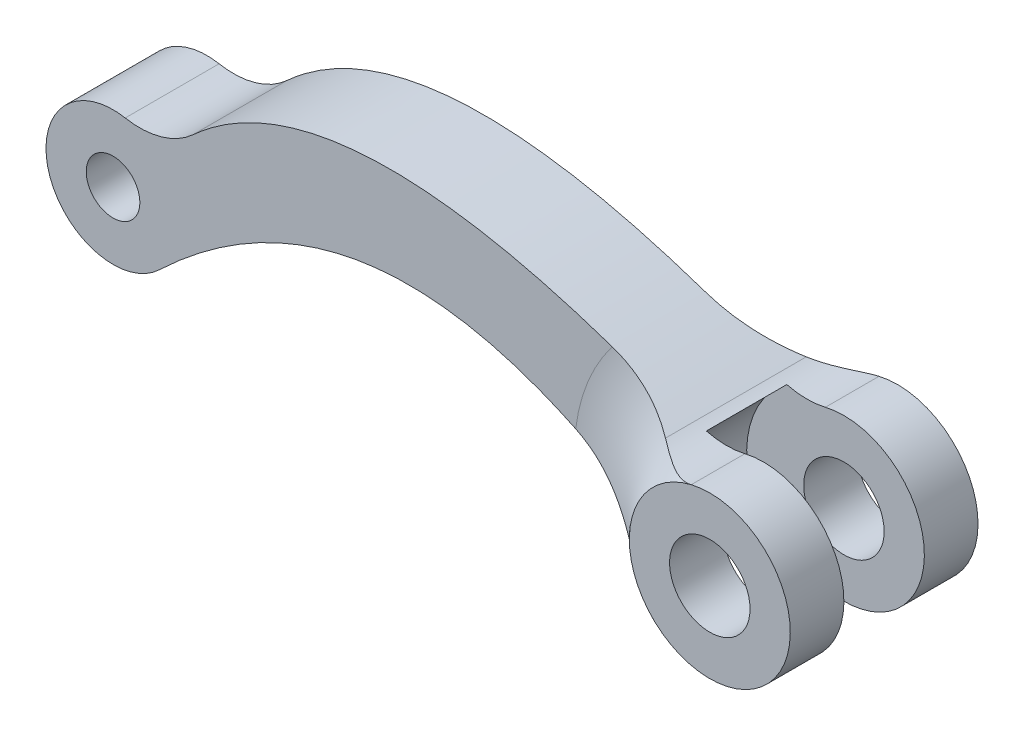
ISO-10303-21;
HEADER;
FILE_DESCRIPTION(('STEP AP214'),'2;1');
FILE_NAME('part.step','',(''),(''),'','','');
FILE_SCHEMA(('AUTOMOTIVE_DESIGN { 1 0 10303 214 1 1 1 1 }'));
ENDSEC;
DATA;
#1=APPLICATION_CONTEXT('core data for automotive mechanical design processes');
#2=APPLICATION_PROTOCOL_DEFINITION('international standard','automotive_design',2000,#1);
#3=PRODUCT_CONTEXT('',#1,'mechanical');
#4=PRODUCT('Part','Part','',(#3));
#5=PRODUCT_RELATED_PRODUCT_CATEGORY('part','',(#4));
#6=PRODUCT_DEFINITION_FORMATION('','',#4);
#7=PRODUCT_DEFINITION_CONTEXT('part definition',#1,'design');
#8=PRODUCT_DEFINITION('design','',#6,#7);
#9=PRODUCT_DEFINITION_SHAPE('','',#8);
#10=(LENGTH_UNIT() NAMED_UNIT(*) SI_UNIT(.MILLI.,.METRE.));
#11=(NAMED_UNIT(*) PLANE_ANGLE_UNIT() SI_UNIT($,.RADIAN.));
#12=(NAMED_UNIT(*) SI_UNIT($,.STERADIAN.) SOLID_ANGLE_UNIT());
#13=UNCERTAINTY_MEASURE_WITH_UNIT(LENGTH_MEASURE(1.E-05),#10,'distance_accuracy_value','');
#14=(GEOMETRIC_REPRESENTATION_CONTEXT(3) GLOBAL_UNCERTAINTY_ASSIGNED_CONTEXT((#13)) GLOBAL_UNIT_ASSIGNED_CONTEXT((#10,
#11,#12)) REPRESENTATION_CONTEXT('',''));
#15=CARTESIAN_POINT('',(0.,0.,0.));
#16=DIRECTION('',(0.,0.,1.));
#17=DIRECTION('',(1.,0.,0.));
#18=AXIS2_PLACEMENT_3D('',#15,#16,#17);
#19=CARTESIAN_POINT('',(19.8983455951839,-4.37909021869303,1.75));
#20=DIRECTION('',(0.,0.,-1.));
#21=DIRECTION('',(-1.,0.,0.));
#22=AXIS2_PLACEMENT_3D('',#19,#20,#21);
#23=CYLINDRICAL_SURFACE('',#22,3.);
#24=CARTESIAN_POINT('',(19.8983455951839,-4.37909021869303,-1.5));
#25=DIRECTION('',(0.,0.,1.));
#26=DIRECTION('',(1.,0.,0.));
#27=AXIS2_PLACEMENT_3D('',#24,#25,#26);
#28=CIRCLE('',#27,3.);
#29=CARTESIAN_POINT('',(21.7342481345183,-2.00644151606854,-1.5));
#30=VERTEX_POINT('',#29);
#31=CARTESIAN_POINT('',(21.949172797592,-2.18954510934651,-1.5));
#32=VERTEX_POINT('',#31);
#33=EDGE_CURVE('E170',#30,#32,#28,.F.);
#34=ORIENTED_EDGE('',*,*,#33,.F.);
#35=DIRECTION('',(0.,0.,-1.));
#36=VECTOR('',#35,1.);
#37=CARTESIAN_POINT('',(21.7342481345183,-2.00644151606854,1.75));
#38=LINE('',#37,#36);
#39=CARTESIAN_POINT('',(21.7342481345183,-2.00644151606854,-3.46932138033454));
#40=VERTEX_POINT('',#39);
#41=EDGE_CURVE('E53',#30,#40,#38,.T.);
#42=ORIENTED_EDGE('',*,*,#41,.T.);
#43=CARTESIAN_POINT('',(21.7342481345183,-2.00644151606854,-3.46932138033454));
#44=CARTESIAN_POINT('',(21.7526198289137,-2.02065607514948,-3.47430392840961));
#45=CARTESIAN_POINT('',(21.7709236479257,-2.03516135527994,-3.47872480307188));
#46=CARTESIAN_POINT('',(21.8072747281919,-2.06467136872878,-3.4863587269212));
#47=CARTESIAN_POINT('',(21.825322644006,-2.07967426383743,-3.48957577716496));
#48=CARTESIAN_POINT('',(21.861166540102,-2.11019449768173,-3.49475214225256));
#49=CARTESIAN_POINT('',(21.8789625005552,-2.12571187658907,-3.49671135863845));
#50=CARTESIAN_POINT('',(21.9142950857563,-2.15726386587699,-3.49933988944338));
#51=CARTESIAN_POINT('',(21.9318306365243,-2.17330004082508,-3.50000484181938));
#52=CARTESIAN_POINT('',(21.949172797592,-2.18954510934651,-3.5));
#53=B_SPLINE_CURVE_WITH_KNOTS('',3,(#43,#44,#45,#46,#47,#48,#49,#50,#51,#52),.UNSPECIFIED.,.F.,
.F.,(4,2,2,2,4),(0.,0.0712681844317605,0.142297350987069,0.213332076730677,0.28460579825421),.UNSPECIFIED.);
#54=CARTESIAN_POINT('',(21.949172797592,-2.18954510934652,-3.5));
#55=VERTEX_POINT('',#54);
#56=EDGE_CURVE('E11',#40,#55,#53,.T.);
#57=ORIENTED_EDGE('',*,*,#56,.T.);
#58=DIRECTION('',(0.,0.,-1.));
#59=VECTOR('',#58,1.);
#60=CARTESIAN_POINT('',(21.949172797592,-2.18954510934651,1.75));
#61=LINE('',#60,#59);
#62=EDGE_CURVE('E286',#32,#55,#61,.T.);
#63=ORIENTED_EDGE('',*,*,#62,.F.);
#64=EDGE_LOOP('',(#34,#42,#57,#63));
#65=FACE_BOUND('',#64,.T.);
#66=ADVANCED_FACE('F34',(#65),#23,.F.);
#67=CARTESIAN_POINT('',(24.,0.,1.75));
#68=DIRECTION('',(0.,0.,-1.));
#69=DIRECTION('',(-1.,0.,0.));
#70=AXIS2_PLACEMENT_3D('',#67,#68,#69);
#71=CYLINDRICAL_SURFACE('',#70,3.);
#72=CARTESIAN_POINT('',(24.,0.,-3.5));
#73=DIRECTION('',(0.,0.,1.));
#74=DIRECTION('',(1.,0.,0.));
#75=AXIS2_PLACEMENT_3D('',#72,#73,#74);
#76=CIRCLE('',#75,3.);
#77=CARTESIAN_POINT('',(23.3091798104987,2.91937792445195,-3.5));
#78=VERTEX_POINT('',#77);
#79=EDGE_CURVE('E177',#55,#78,#76,.T.);
#80=ORIENTED_EDGE('',*,*,#79,.T.);
#81=DIRECTION('',(0.,0.,-1.));
#82=VECTOR('',#81,1.);
#83=CARTESIAN_POINT('',(23.3091798104987,2.91937792445194,1.75));
#84=LINE('',#83,#82);
#85=CARTESIAN_POINT('',(23.3091798104987,2.91937792445195,-1.5));
#86=VERTEX_POINT('',#85);
#87=EDGE_CURVE('E292',#78,#86,#84,.F.);
#88=ORIENTED_EDGE('',*,*,#87,.T.);
#89=CARTESIAN_POINT('',(24.,0.,-1.5));
#90=DIRECTION('',(0.,0.,1.));
#91=DIRECTION('',(1.,0.,0.));
#92=AXIS2_PLACEMENT_3D('',#89,#90,#91);
#93=CIRCLE('',#92,3.);
#94=EDGE_CURVE('E402',#32,#86,#93,.T.);
#95=ORIENTED_EDGE('',*,*,#94,.F.);
#96=ORIENTED_EDGE('',*,*,#62,.T.);
#97=EDGE_LOOP('',(#80,#88,#95,#96));
#98=FACE_BOUND('',#97,.T.);
#99=ADVANCED_FACE('F242',(#98),#71,.T.);
#100=CARTESIAN_POINT('',(1.73493515728975,-1.8,1.75));
#101=CARTESIAN_POINT('',(10.5890763200093,6.61744334853081,1.75));
#102=CARTESIAN_POINT('',(21.7342481345183,-2.00644151606854,1.75));
#103=B_SPLINE_CURVE_WITH_KNOTS('',2,(#100,#101,#102),.UNSPECIFIED.,.F.,.F.,(3,3),(0.,1.),.UNSPECIFIED.);
#104=DIRECTION('',(0.,0.,-1.));
#105=VECTOR('',#104,1.);
#106=SURFACE_OF_LINEAR_EXTRUSION('',#103,#105);
#107=CARTESIAN_POINT('',(1.73493515728975,-1.8,-1.5));
#108=CARTESIAN_POINT('',(10.5890763200093,6.61744334853081,-1.5));
#109=CARTESIAN_POINT('',(21.7342481345183,-2.00644151606854,-1.5));
#110=B_SPLINE_CURVE_WITH_KNOTS('',2,(#107,#108,#109),.UNSPECIFIED.,.F.,.F.,(3,3),(0.,1.),.UNSPECIFIED.);
#111=CARTESIAN_POINT('',(20.5587948379701,-1.13982822192764,-1.5));
#112=VERTEX_POINT('',#111);
#113=EDGE_CURVE('E164',#112,#30,#110,.T.);
#114=ORIENTED_EDGE('',*,*,#113,.F.);
#115=DIRECTION('',(0.,0.,-1.));
#116=VECTOR('',#115,1.);
#117=CARTESIAN_POINT('',(20.5587948379701,-1.13982822192764,1.75));
#118=LINE('',#117,#116);
#119=CARTESIAN_POINT('',(20.5587948379701,-1.13982822192764,1.5));
#120=VERTEX_POINT('',#119);
#121=EDGE_CURVE('E155',#112,#120,#118,.F.);
#122=ORIENTED_EDGE('',*,*,#121,.T.);
#123=CARTESIAN_POINT('',(1.73493515728975,-1.8,1.5));
#124=CARTESIAN_POINT('',(10.5890763200093,6.61744334853081,1.5));
#125=CARTESIAN_POINT('',(21.7342481345183,-2.00644151606854,1.5));
#126=B_SPLINE_CURVE_WITH_KNOTS('',2,(#123,#124,#125),.UNSPECIFIED.,.F.,.F.,(3,3),(0.,1.),.UNSPECIFIED.);
#127=CARTESIAN_POINT('',(21.7342481345183,-2.00644151606854,1.5));
#128=VERTEX_POINT('',#127);
#129=EDGE_CURVE('E140',#120,#128,#126,.T.);
#130=ORIENTED_EDGE('',*,*,#129,.T.);
#131=CARTESIAN_POINT('',(21.7342481345183,-2.00644151606854,3.46932138033453));
#132=VERTEX_POINT('',#131);
#133=EDGE_CURVE('E272',#132,#128,#38,.T.);
#134=ORIENTED_EDGE('',*,*,#133,.F.);
#135=CARTESIAN_POINT('',(21.7342481345183,-2.00644151606854,3.46932138033453));
#136=CARTESIAN_POINT('',(21.6734804954553,-1.95942119551907,3.45285193536921));
#137=CARTESIAN_POINT('',(21.6131640722433,-1.91308977671675,3.43320879719704));
#138=CARTESIAN_POINT('',(21.4937909265621,-1.82205245682198,3.38900424658843));
#139=CARTESIAN_POINT('',(21.4347284427622,-1.7773376798083,3.36447700349402));
#140=CARTESIAN_POINT('',(21.317537619663,-1.68925063622987,3.31173796775486));
#141=CARTESIAN_POINT('',(21.2594074098336,-1.64587545917933,3.28353497772249));
#142=CARTESIAN_POINT('',(21.1437493558439,-1.56019645073285,3.22446437002579));
#143=CARTESIAN_POINT('',(21.0862213850932,-1.51789239142399,3.19359732548866));
#144=CARTESIAN_POINT('',(20.9707131943213,-1.43357168487102,3.12961549101444));
#145=CARTESIAN_POINT('',(20.912738151409,-1.39156764794546,3.09647500815804));
#146=CARTESIAN_POINT('',(20.7968572541206,-1.30824216394491,3.02904561306408));
#147=CARTESIAN_POINT('',(20.7389515368889,-1.26692148223411,2.9947555282452));
#148=CARTESIAN_POINT('',(20.6230011470518,-1.18481862553785,2.92563043624156));
#149=CARTESIAN_POINT('',(20.5649564011451,-1.1440368975453,2.89079502339822));
#150=CARTESIAN_POINT('',(20.4485571918544,-1.06290323794126,2.82108226724726));
#151=CARTESIAN_POINT('',(20.3902026307496,-1.02255145569827,2.7862049137695));
#152=CARTESIAN_POINT('',(20.2220074421137,-0.907192088073592,2.68663467901254));
#153=CARTESIAN_POINT('',(20.1115848176147,-0.832606276815641,2.6224270553171));
#154=CARTESIAN_POINT('',(19.8883051701104,-0.684224765570693,2.49757478161263));
#155=CARTESIAN_POINT('',(19.775449514185,-0.610428655037382,2.43692819855455));
#156=CARTESIAN_POINT('',(19.5466700067505,-0.463418696099621,2.32085630904226));
#157=CARTESIAN_POINT('',(19.4307458875446,-0.390204899226374,2.26543146007465));
#158=CARTESIAN_POINT('',(19.196899758719,-0.245267633638991,2.16186044974607));
#159=CARTESIAN_POINT('',(19.0790169961946,-0.173536750460456,2.11363671113366));
#160=CARTESIAN_POINT('',(18.8398580269226,-0.0309031661338106,2.02491420561541));
#161=CARTESIAN_POINT('',(18.7185817478715,0.0399995173226713,1.98441560344818));
#162=CARTESIAN_POINT('',(18.4728574037876,0.180573666534587,1.91224664931044));
#163=CARTESIAN_POINT('',(18.3484118108324,0.25024602420635,1.88056963354288));
#164=CARTESIAN_POINT('',(18.0653837672967,0.405019529676066,1.82032360057307));
#165=CARTESIAN_POINT('',(17.9059622177385,0.489680667384373,1.79445511900599));
#166=CARTESIAN_POINT('',(17.6630892959685,0.614558385246709,1.76805730319302));
#167=CARTESIAN_POINT('',(17.58095428413,0.656098557506864,1.76132312596252));
#168=CARTESIAN_POINT('',(17.4159080686405,0.738147241324251,1.75229311742182));
#169=CARTESIAN_POINT('',(17.3329967039666,0.778655532073645,1.74999822831197));
#170=CARTESIAN_POINT('',(17.2497813184491,0.818580467393256,1.75));
#171=B_SPLINE_CURVE_WITH_KNOTS('',3,(#135,#136,#137,#138,#139,#140,#141,#142,#143,#144,#145,
#146,#147,#148,#149,#150,#151,#152,#153,#154,#155,#156,#157,#158,#159,#160,#161,#162,#163,#164,
#165,#166,#167,#168,#169,#170),.UNSPECIFIED.,.F.,.F.,(4,2,2,2,2,2,2,2,2,2,2,2,2,2,2,2,2,4),(0.,
0.2355354018149,0.469477486421311,0.702869285716018,0.936210999194895,1.17286598895296,
1.40977018336104,1.64685987724214,1.88402941620388,2.32773676239872,2.77120097967103,
3.21470401367263,3.65301778680796,4.0913409059439,4.52933201352217,5.07551339134825,
5.35227673222676,5.62909880727952),.UNSPECIFIED.);
#172=CARTESIAN_POINT('',(17.2497813184491,0.818580467393257,1.75));
#173=VERTEX_POINT('',#172);
#174=EDGE_CURVE('E315',#132,#173,#171,.T.);
#175=ORIENTED_EDGE('',*,*,#174,.T.);
#176=CARTESIAN_POINT('',(1.73493515728975,-1.8,1.75));
#177=VERTEX_POINT('',#176);
#178=EDGE_CURVE('E248',#177,#173,#103,.T.);
#179=ORIENTED_EDGE('',*,*,#178,.F.);
#180=DIRECTION('',(0.,0.,-1.));
#181=VECTOR('',#180,1.);
#182=CARTESIAN_POINT('',(1.73493515728975,-1.8,1.75));
#183=LINE('',#182,#181);
#184=CARTESIAN_POINT('',(1.73493515728975,-1.8,-1.75));
#185=VERTEX_POINT('',#184);
#186=EDGE_CURVE('E277',#177,#185,#183,.T.);
#187=ORIENTED_EDGE('',*,*,#186,.T.);
#188=CARTESIAN_POINT('',(1.73493515728975,-1.8,-1.75));
#189=CARTESIAN_POINT('',(10.5890763200093,6.61744334853081,-1.75));
#190=CARTESIAN_POINT('',(21.7342481345183,-2.00644151606854,-1.75));
#191=B_SPLINE_CURVE_WITH_KNOTS('',2,(#188,#189,#190),.UNSPECIFIED.,.F.,.F.,(3,3),(0.,1.),.UNSPECIFIED.);
#192=CARTESIAN_POINT('',(17.2497813184491,0.818580467393257,-1.75));
#193=VERTEX_POINT('',#192);
#194=EDGE_CURVE('E199',#185,#193,#191,.T.);
#195=ORIENTED_EDGE('',*,*,#194,.T.);
#196=CARTESIAN_POINT('',(17.2497813184491,0.818580467393257,-1.75));
#197=CARTESIAN_POINT('',(17.3371154760831,0.776680567426927,-1.74999448989186));
#198=CARTESIAN_POINT('',(17.4241261777844,0.734130820742864,-1.75252460736791));
#199=CARTESIAN_POINT('',(17.5972030024072,0.647941578124018,-1.76246302927046));
#200=CARTESIAN_POINT('',(17.6832700893189,0.604303380197852,-1.76986576764265));
#201=CARTESIAN_POINT('',(17.8543330344919,0.516065879495559,-1.7893538993404));
#202=CARTESIAN_POINT('',(17.9393292468216,0.471466908343907,-1.80143770063367));
#203=CARTESIAN_POINT('',(18.1065302853072,0.382296516639167,-1.82979454547133));
#204=CARTESIAN_POINT('',(18.1887575199014,0.33774045619772,-1.8459842371373));
#205=CARTESIAN_POINT('',(18.3519615042621,0.247960560203948,-1.88242746112701));
#206=CARTESIAN_POINT('',(18.4329379328068,0.202736558763347,-1.90268201926609));
#207=CARTESIAN_POINT('',(18.5935398035643,0.111750526183883,-1.94699616574966));
#208=CARTESIAN_POINT('',(18.6731651412377,0.0659884538718848,-1.97105604705434));
#209=CARTESIAN_POINT('',(18.8416357342252,-0.0321570800999786,-2.02617764674639));
#210=CARTESIAN_POINT('',(18.9302789560651,-0.0846024923440787,-2.05774593496078));
#211=CARTESIAN_POINT('',(19.1057290274,-0.189923303514532,-2.12497404143243));
#212=CARTESIAN_POINT('',(19.1925358984641,-0.242798697380328,-2.16063381160064));
#213=CARTESIAN_POINT('',(19.3643456768693,-0.348893621099651,-2.23555372545197));
#214=CARTESIAN_POINT('',(19.4493487718382,-0.402113114401269,-2.27481349238184));
#215=CARTESIAN_POINT('',(19.6182960311716,-0.509269046093717,-2.35670628477786));
#216=CARTESIAN_POINT('',(19.7022273815612,-0.563207864744022,-2.39936250915869));
#217=CARTESIAN_POINT('',(19.8685501632664,-0.671429227119991,-2.48717305131634));
#218=CARTESIAN_POINT('',(19.9509414801599,-0.725711795987791,-2.5323275537322));
#219=CARTESIAN_POINT('',(20.1144585517368,-0.834723778051313,-2.62444195648333));
#220=CARTESIAN_POINT('',(20.1955837992161,-0.889453357595377,-2.67140255552382));
#221=CARTESIAN_POINT('',(20.3371314678077,-0.986034088861208,-2.75465498380698));
#222=CARTESIAN_POINT('',(20.3977605853121,-1.02775827398713,-2.79074447401928));
#223=CARTESIAN_POINT('',(20.5186409037786,-1.1116418559758,-2.86301650258537));
#224=CARTESIAN_POINT('',(20.5788921714409,-1.1538011723396,-2.89919902283059));
#225=CARTESIAN_POINT('',(20.6992002744113,-1.23867012954327,-2.97111936445906));
#226=CARTESIAN_POINT('',(20.7592572117624,-1.28137938899856,-3.00685746345524));
#227=CARTESIAN_POINT('',(20.8794003645614,-1.36750115286112,-3.0772419894545));
#228=CARTESIAN_POINT('',(20.9394864916714,-1.41091291659133,-3.11188946556098));
#229=CARTESIAN_POINT('',(21.0594635396311,-1.49827677160756,-3.17903295642282));
#230=CARTESIAN_POINT('',(21.1193512090889,-1.54222027407316,-3.21154576796009));
#231=CARTESIAN_POINT('',(21.239744164938,-1.6312413987234,-3.27380758381055));
#232=CARTESIAN_POINT('',(21.3002495251784,-1.6763191574824,-3.30355625325355));
#233=CARTESIAN_POINT('',(21.4222456815455,-1.7679054089216,-3.35917375144028));
#234=CARTESIAN_POINT('',(21.4837383931208,-1.81441690034223,-3.38503367445152));
#235=CARTESIAN_POINT('',(21.6080672556834,-1.90917538376815,-3.43154223507378));
#236=CARTESIAN_POINT('',(21.6709097585045,-1.95743215794266,-3.45215357340883));
#237=CARTESIAN_POINT('',(21.7342481345183,-2.00644151606854,-3.46932138033454));
#238=B_SPLINE_CURVE_WITH_KNOTS('',3,(#196,#197,#198,#199,#200,#201,#202,#203,#204,#205,#206,
#207,#208,#209,#210,#211,#212,#213,#214,#215,#216,#217,#218,#219,#220,#221,#222,#223,#224,#225,
#226,#227,#228,#229,#230,#231,#232,#233,#234,#235,#236,#237),.UNSPECIFIED.,.F.,.F.,(4,2,2,2,2,2,
2,2,2,2,2,2,2,2,2,2,2,2,2,2,4),(0.,0.290544067770823,0.580756818155392,0.870870953543187,
1.15551075294437,1.44022247497173,1.72495612676166,2.04802540110777,2.3710908786618,
2.69412258469883,3.01958954629652,3.34508059424098,3.67069885363544,3.9166098806165,
4.16247620184046,4.40818033007858,4.65364039885861,4.89685261766763,5.14009426282969,
5.38388474627872,5.62936220919816),.UNSPECIFIED.);
#239=EDGE_CURVE('E47',#193,#40,#238,.T.);
#240=ORIENTED_EDGE('',*,*,#239,.T.);
#241=ORIENTED_EDGE('',*,*,#41,.F.);
#242=EDGE_LOOP('',(#114,#122,#130,#134,#175,#179,#187,#195,#240,#241));
#243=FACE_BOUND('',#242,.T.);
#244=ADVANCED_FACE('F163',(#243),#106,.F.);
#245=CARTESIAN_POINT('',(22.6183596209973,5.83875584890389,0.));
#246=DIRECTION('',(0.,0.,-1.));
#247=DIRECTION('',(-1.,0.,0.));
#248=AXIS2_PLACEMENT_3D('',#245,#246,#247);
#249=CYLINDRICAL_SURFACE('',#248,3.);
#250=CARTESIAN_POINT('',(22.6183596209973,5.83875584890389,-1.5));
#251=DIRECTION('',(0.,0.,1.));
#252=DIRECTION('',(1.,0.,0.));
#253=AXIS2_PLACEMENT_3D('',#250,#251,#252);
#254=CIRCLE('',#253,3.);
#255=CARTESIAN_POINT('',(21.870308450585,2.93351585082374,-1.5));
#256=VERTEX_POINT('',#255);
#257=EDGE_CURVE('E301',#86,#256,#254,.F.);
#258=ORIENTED_EDGE('',*,*,#257,.F.);
#259=ORIENTED_EDGE('',*,*,#87,.F.);
#260=CARTESIAN_POINT('',(23.3091798104987,2.91937792445195,-3.5));
#261=CARTESIAN_POINT('',(23.2712737645803,2.9103999582637,-3.50003319896805));
#262=CARTESIAN_POINT('',(23.2332104671054,2.9021804102273,-3.49822676600815));
#263=CARTESIAN_POINT('',(23.1571839448376,2.8872897057438,-3.49119660385466));
#264=CARTESIAN_POINT('',(23.1192206899943,2.88061505662388,-3.48598068697856));
#265=CARTESIAN_POINT('',(23.0443474378794,2.86891625189009,-3.4725198336404));
#266=CARTESIAN_POINT('',(23.0074310989027,2.86386327153427,-3.46433404266892));
#267=CARTESIAN_POINT('',(22.934105042206,2.85518946948249,-3.44530778066566));
#268=CARTESIAN_POINT('',(22.8976956503799,2.85156953141143,-3.43446567838049));
#269=CARTESIAN_POINT('',(22.8058103646435,2.84409450801051,-3.4040088196077));
#270=CARTESIAN_POINT('',(22.7507740429932,2.84118941386614,-3.38283575510372));
#271=CARTESIAN_POINT('',(22.6423023506534,2.8383599258672,-3.33657514474973));
#272=CARTESIAN_POINT('',(22.5888680624612,2.83843750392136,-3.31148502016211));
#273=CARTESIAN_POINT('',(22.4826759874748,2.8413481441733,-3.25817714092802));
#274=CARTESIAN_POINT('',(22.4299402856918,2.84422241815569,-3.22991820601292));
#275=CARTESIAN_POINT('',(22.3257292787554,2.85260443516345,-3.17151911402399));
#276=CARTESIAN_POINT('',(22.2742543930779,2.85811304245445,-3.14137834238534));
#277=CARTESIAN_POINT('',(22.1571279432026,2.8736716640551,-3.07076829917914));
#278=CARTESIAN_POINT('',(22.0918313849757,2.88458647542927,-3.02990168115064));
#279=CARTESIAN_POINT('',(21.962571670321,2.91056783332092,-2.94737730924638));
#280=CARTESIAN_POINT('',(21.8986087761548,2.92563518829506,-2.90571940278702));
#281=CARTESIAN_POINT('',(21.7735950381924,2.95944222994063,-2.82369096735078));
#282=CARTESIAN_POINT('',(21.7125135419212,2.97806272347057,-2.78331814465561));
#283=CARTESIAN_POINT('',(21.591293130165,3.01932142192812,-2.7032649909103));
#284=CARTESIAN_POINT('',(21.531153915653,3.04195832297094,-2.66358443969936));
#285=CARTESIAN_POINT('',(21.4714318632668,3.06665254661748,-2.6245450660752));
#286=B_SPLINE_CURVE_WITH_KNOTS('',3,(#260,#261,#262,#263,#264,#265,#266,#267,#268,#269,#270,
#271,#272,#273,#274,#275,#276,#277,#278,#279,#280,#281,#282,#283,#284,#285),.UNSPECIFIED.,.F.,
.F.,(4,2,2,2,2,2,2,2,2,2,2,2,4),(0.,0.116780306164461,0.233293961473148,0.347604286485345,
0.461984986745344,0.638793551389136,0.815719009985947,0.995291729958749,1.1749234041698,
1.40817748102036,1.64147700211125,1.86800961182901,2.09446881421191),.UNSPECIFIED.);
#287=CARTESIAN_POINT('',(21.4714318632668,3.06665254661748,-2.62454506607518));
#288=VERTEX_POINT('',#287);
#289=EDGE_CURVE('E227',#78,#288,#286,.T.);
#290=ORIENTED_EDGE('',*,*,#289,.T.);
#291=DIRECTION('',(0.,0.,-1.));
#292=VECTOR('',#291,1.);
#293=CARTESIAN_POINT('',(21.4714318632668,3.06665254661748,1.75));
#294=LINE('',#293,#292);
#295=CARTESIAN_POINT('',(21.4714318632668,3.06665254661748,2.62454506607516));
#296=VERTEX_POINT('',#295);
#297=EDGE_CURVE('E61',#296,#288,#294,.T.);
#298=ORIENTED_EDGE('',*,*,#297,.F.);
#299=CARTESIAN_POINT('',(21.4714318632668,3.06665254661747,2.62454506607516));
#300=CARTESIAN_POINT('',(21.5145582967282,3.04881220510832,2.65275368020573));
#301=CARTESIAN_POINT('',(21.5579118757237,3.03205051900831,2.6812828490202));
#302=CARTESIAN_POINT('',(21.6450904335363,3.00064094777501,2.73877716640658));
#303=CARTESIAN_POINT('',(21.6889153893325,2.98599295991368,2.76774229371482));
#304=CARTESIAN_POINT('',(21.8216105854413,2.94500317518637,2.85530571440114));
#305=CARTESIAN_POINT('',(21.9112306635209,2.92180952879667,2.91425957343285));
#306=CARTESIAN_POINT('',(22.0979471841681,2.88261358700884,3.03408200041819));
#307=CARTESIAN_POINT('',(22.1951861095929,2.86706685457835,3.09488223800925));
#308=CARTESIAN_POINT('',(22.3440635175641,2.85090859175532,3.18195231861376));
#309=CARTESIAN_POINT('',(22.3941305337448,2.84671689780211,3.21025576441669));
#310=CARTESIAN_POINT('',(22.4955252131482,2.84084096648311,3.26476851005447));
#311=CARTESIAN_POINT('',(22.5468522418801,2.83915549238702,3.29097883672251));
#312=CARTESIAN_POINT('',(22.6371208016994,2.83857183417063,3.33380254947984));
#313=CARTESIAN_POINT('',(22.6757237166053,2.83905130298035,3.35111375745847));
#314=CARTESIAN_POINT('',(22.7537466344988,2.84155727623192,3.38364513470214));
#315=CARTESIAN_POINT('',(22.7931667691834,2.84358403193817,3.3988649638738));
#316=CARTESIAN_POINT('',(22.9115917264449,2.85208710945603,3.4401946713748));
#317=CARTESIAN_POINT('',(22.9918874040947,2.86097275840674,3.46253953490272));
#318=CARTESIAN_POINT('',(23.1119936221784,2.87938248650098,3.48490512900071));
#319=CARTESIAN_POINT('',(23.151220779642,2.88618945326842,3.49049391411147));
#320=CARTESIAN_POINT('',(23.2300756753954,2.90150532795332,3.49807428007293));
#321=CARTESIAN_POINT('',(23.2697036880249,2.91002974846524,3.50003128085174));
#322=CARTESIAN_POINT('',(23.3091798104987,2.91937792445195,3.5));
#323=B_SPLINE_CURVE_WITH_KNOTS('',3,(#299,#300,#301,#302,#303,#304,#305,#306,#307,#308,#309,
#310,#311,#312,#313,#314,#315,#316,#317,#318,#319,#320,#321,#322),.UNSPECIFIED.,.F.,.F.,(4,2,2,
2,2,2,2,2,2,2,2,4),(0.,0.163575379566737,0.327142806510729,0.656063901023312,1.00273307410871,
1.17565265848537,1.3484868848502,1.47533026218865,1.60219424204622,1.85217089334654,
1.97260447775636,2.09417900206978),.UNSPECIFIED.);
#324=CARTESIAN_POINT('',(23.3091798104987,2.91937792445195,3.5));
#325=VERTEX_POINT('',#324);
#326=EDGE_CURVE('E307',#296,#325,#323,.T.);
#327=ORIENTED_EDGE('',*,*,#326,.T.);
#328=CARTESIAN_POINT('',(23.3091798104987,2.91937792445195,1.5));
#329=VERTEX_POINT('',#328);
#330=EDGE_CURVE('E291',#329,#325,#84,.F.);
#331=ORIENTED_EDGE('',*,*,#330,.F.);
#332=CARTESIAN_POINT('',(22.6183596209973,5.83875584890389,1.5));
#333=DIRECTION('',(0.,0.,1.));
#334=DIRECTION('',(1.,0.,0.));
#335=AXIS2_PLACEMENT_3D('',#332,#333,#334);
#336=CIRCLE('',#335,3.);
#337=CARTESIAN_POINT('',(21.870308450585,2.93351585082374,1.5));
#338=VERTEX_POINT('',#337);
#339=EDGE_CURVE('E298',#329,#338,#336,.F.);
#340=ORIENTED_EDGE('',*,*,#339,.T.);
#341=DIRECTION('',(0.,0.,1.));
#342=VECTOR('',#341,1.);
#343=CARTESIAN_POINT('',(21.870308450585,2.93351585082374,0.));
#344=LINE('',#343,#342);
#345=EDGE_CURVE('E158',#338,#256,#344,.F.);
#346=ORIENTED_EDGE('',*,*,#345,.T.);
#347=EDGE_LOOP('',(#258,#259,#290,#298,#327,#331,#340,#346));
#348=FACE_BOUND('',#347,.T.);
#349=ADVANCED_FACE('F241',(#348),#249,.F.);
#350=CARTESIAN_POINT('',(24.,0.,1.75));
#351=DIRECTION('',(0.,0.,-1.));
#352=DIRECTION('',(-1.,0.,0.));
#353=AXIS2_PLACEMENT_3D('',#350,#351,#352);
#354=CYLINDRICAL_SURFACE('',#353,1.5);
#355=CARTESIAN_POINT('',(24.,0.,-3.5));
#356=DIRECTION('',(0.,0.,1.));
#357=DIRECTION('',(1.,0.,0.));
#358=AXIS2_PLACEMENT_3D('',#355,#356,#357);
#359=CIRCLE('',#358,1.5);
#360=CARTESIAN_POINT('',(25.5,0.,-3.5));
#361=VERTEX_POINT('',#360);
#362=EDGE_CURVE('E165',#361,#361,#359,.T.);
#363=ORIENTED_EDGE('',*,*,#362,.F.);
#364=EDGE_LOOP('',(#363));
#365=FACE_BOUND('',#364,.T.);
#366=CARTESIAN_POINT('',(24.,0.,-1.5));
#367=DIRECTION('',(0.,0.,1.));
#368=DIRECTION('',(1.,0.,0.));
#369=AXIS2_PLACEMENT_3D('',#366,#367,#368);
#370=CIRCLE('',#369,1.5);
#371=CARTESIAN_POINT('',(25.5,0.,-1.5));
#372=VERTEX_POINT('',#371);
#373=EDGE_CURVE('E150',#372,#372,#370,.T.);
#374=ORIENTED_EDGE('',*,*,#373,.T.);
#375=EDGE_LOOP('',(#374));
#376=FACE_BOUND('',#375,.T.);
#377=ADVANCED_FACE('F357',(#365,#376),#354,.F.);
#378=CARTESIAN_POINT('',(19.8983455951839,-4.37909021869303,1.75));
#379=DIRECTION('',(0.,0.,1.));
#380=DIRECTION('',(1.,0.,0.));
#381=AXIS2_PLACEMENT_3D('',#378,#379,#380);
#382=PLANE('',#381);
#383=CARTESIAN_POINT('',(0.,0.,1.75));
#384=DIRECTION('',(0.,0.,1.));
#385=DIRECTION('',(1.,0.,0.));
#386=AXIS2_PLACEMENT_3D('',#383,#384,#385);
#387=CIRCLE('',#386,0.999999999999999);
#388=CARTESIAN_POINT('',(0.999999999999999,0.,1.75));
#389=VERTEX_POINT('',#388);
#390=EDGE_CURVE('E187',#389,#389,#387,.T.);
#391=ORIENTED_EDGE('',*,*,#390,.F.);
#392=EDGE_LOOP('',(#391));
#393=FACE_BOUND('',#392,.T.);
#394=ORIENTED_EDGE('',*,*,#178,.T.);
#395=CARTESIAN_POINT('',(24.,0.,1.75));
#396=DIRECTION('',(0.,0.,1.));
#397=DIRECTION('',(1.,0.,0.));
#398=AXIS2_PLACEMENT_3D('',#395,#396,#397);
#399=CIRCLE('',#398,6.79967103839267);
#400=CARTESIAN_POINT('',(18.6129488519766,4.14912113090617,1.75));
#401=VERTEX_POINT('',#400);
#402=EDGE_CURVE('E302',#173,#401,#399,.F.);
#403=ORIENTED_EDGE('',*,*,#402,.T.);
#404=CARTESIAN_POINT('',(22.5309283549471,2.61568891531493,1.75));
#405=CARTESIAN_POINT('',(8.89729445949298,8.5773402204641,1.75));
#406=CARTESIAN_POINT('',(2.98023453297237,3.17991438633031,1.75));
#407=B_SPLINE_CURVE_WITH_KNOTS('',2,(#404,#405,#406),.UNSPECIFIED.,.F.,.F.,(3,3),(0.,1.),.UNSPECIFIED.);
#408=CARTESIAN_POINT('',(2.98023453297237,3.17991438633031,1.75));
#409=VERTEX_POINT('',#408);
#410=EDGE_CURVE('E193',#401,#409,#407,.T.);
#411=ORIENTED_EDGE('',*,*,#410,.T.);
#412=CARTESIAN_POINT('',(0.991404427299883,5.36021797559139,1.75));
#413=DIRECTION('',(0.,0.,-1.));
#414=DIRECTION('',(1.,0.,0.));
#415=AXIS2_PLACEMENT_3D('',#412,#413,#414);
#416=CIRCLE('',#415,2.95113011074978);
#417=CARTESIAN_POINT('',(0.454678391066472,2.4583058314004,1.75));
#418=VERTEX_POINT('',#417);
#419=EDGE_CURVE('E198',#409,#418,#416,.T.);
#420=ORIENTED_EDGE('',*,*,#419,.T.);
#421=CARTESIAN_POINT('',(0.,0.,1.75));
#422=DIRECTION('',(0.,0.,1.));
#423=DIRECTION('',(1.,0.,0.));
#424=AXIS2_PLACEMENT_3D('',#421,#422,#423);
#425=CIRCLE('',#424,2.5);
#426=EDGE_CURVE('E254',#418,#177,#425,.T.);
#427=ORIENTED_EDGE('',*,*,#426,.T.);
#428=EDGE_LOOP('',(#394,#403,#411,#420,#427));
#429=FACE_BOUND('',#428,.T.);
#430=ADVANCED_FACE('F355',(#393,#429),#382,.T.);
#431=CARTESIAN_POINT('',(19.8983455951839,-4.37909021869303,-1.75));
#432=DIRECTION('',(0.,0.,1.));
#433=DIRECTION('',(1.,0.,0.));
#434=AXIS2_PLACEMENT_3D('',#431,#432,#433);
#435=PLANE('',#434);
#436=CARTESIAN_POINT('',(0.,0.,-1.75));
#437=DIRECTION('',(0.,0.,1.));
#438=DIRECTION('',(1.,0.,0.));
#439=AXIS2_PLACEMENT_3D('',#436,#437,#438);
#440=CIRCLE('',#439,0.999999999999999);
#441=CARTESIAN_POINT('',(0.999999999999999,0.,-1.75));
#442=VERTEX_POINT('',#441);
#443=EDGE_CURVE('E182',#442,#442,#440,.T.);
#444=ORIENTED_EDGE('',*,*,#443,.T.);
#445=EDGE_LOOP('',(#444));
#446=FACE_BOUND('',#445,.T.);
#447=CARTESIAN_POINT('',(22.5309283549471,2.61568891531493,-1.75));
#448=CARTESIAN_POINT('',(8.89729445949298,8.5773402204641,-1.75));
#449=CARTESIAN_POINT('',(2.98023453297237,3.17991438633031,-1.75));
#450=B_SPLINE_CURVE_WITH_KNOTS('',2,(#447,#448,#449),.UNSPECIFIED.,.F.,.F.,(3,3),(0.,1.),.UNSPECIFIED.);
#451=CARTESIAN_POINT('',(18.6129488519766,4.14912113090617,-1.75));
#452=VERTEX_POINT('',#451);
#453=CARTESIAN_POINT('',(2.98023453297237,3.17991438633031,-1.75));
#454=VERTEX_POINT('',#453);
#455=EDGE_CURVE('E190',#452,#454,#450,.T.);
#456=ORIENTED_EDGE('',*,*,#455,.F.);
#457=CARTESIAN_POINT('',(24.,0.,-1.75));
#458=DIRECTION('',(0.,0.,1.));
#459=DIRECTION('',(1.,0.,0.));
#460=AXIS2_PLACEMENT_3D('',#457,#458,#459);
#461=CIRCLE('',#460,6.79967103839267);
#462=EDGE_CURVE('E334',#452,#193,#461,.T.);
#463=ORIENTED_EDGE('',*,*,#462,.T.);
#464=ORIENTED_EDGE('',*,*,#194,.F.);
#465=CARTESIAN_POINT('',(0.,0.,-1.75));
#466=DIRECTION('',(0.,0.,1.));
#467=DIRECTION('',(1.,0.,0.));
#468=AXIS2_PLACEMENT_3D('',#465,#466,#467);
#469=CIRCLE('',#468,2.5);
#470=CARTESIAN_POINT('',(0.454678391066472,2.4583058314004,-1.75));
#471=VERTEX_POINT('',#470);
#472=EDGE_CURVE('E266',#471,#185,#469,.T.);
#473=ORIENTED_EDGE('',*,*,#472,.F.);
#474=CARTESIAN_POINT('',(0.991404427299883,5.36021797559139,-1.75));
#475=DIRECTION('',(0.,0.,-1.));
#476=DIRECTION('',(1.,0.,0.));
#477=AXIS2_PLACEMENT_3D('',#474,#475,#476);
#478=CIRCLE('',#477,2.95113011074978);
#479=EDGE_CURVE('E261',#454,#471,#478,.T.);
#480=ORIENTED_EDGE('',*,*,#479,.F.);
#481=EDGE_LOOP('',(#456,#463,#464,#473,#480));
#482=FACE_BOUND('',#481,.T.);
#483=ADVANCED_FACE('F243',(#446,#482),#435,.F.);
#484=ORIENTED_EDGE('',*,*,#133,.T.);
#485=CARTESIAN_POINT('',(19.8983455951839,-4.37909021869303,1.5));
#486=DIRECTION('',(0.,0.,1.));
#487=DIRECTION('',(1.,0.,0.));
#488=AXIS2_PLACEMENT_3D('',#485,#486,#487);
#489=CIRCLE('',#488,3.);
#490=CARTESIAN_POINT('',(21.949172797592,-2.18954510934651,1.5));
#491=VERTEX_POINT('',#490);
#492=EDGE_CURVE('E146',#128,#491,#489,.F.);
#493=ORIENTED_EDGE('',*,*,#492,.T.);
#494=CARTESIAN_POINT('',(21.949172797592,-2.18954510934652,3.5));
#495=VERTEX_POINT('',#494);
#496=EDGE_CURVE('E287',#495,#491,#61,.T.);
#497=ORIENTED_EDGE('',*,*,#496,.F.);
#498=CARTESIAN_POINT('',(21.949172797592,-2.18954510934652,3.5));
#499=CARTESIAN_POINT('',(21.9318306365243,-2.17330004082508,3.50000484181939));
#500=CARTESIAN_POINT('',(21.9142950857563,-2.15726386587699,3.49933988944338));
#501=CARTESIAN_POINT('',(21.8789625005552,-2.12571187658907,3.49671135863845));
#502=CARTESIAN_POINT('',(21.861166540102,-2.11019449768173,3.49475214225256));
#503=CARTESIAN_POINT('',(21.825322644006,-2.07967426383743,3.48957577716496));
#504=CARTESIAN_POINT('',(21.8072747281919,-2.06467136872878,3.48635872692121));
#505=CARTESIAN_POINT('',(21.7709236479257,-2.03516135527994,3.47872480307188));
#506=CARTESIAN_POINT('',(21.7526198289137,-2.02065607514948,3.47430392840961));
#507=CARTESIAN_POINT('',(21.7342481345183,-2.00644151606854,3.46932138033454));
#508=B_SPLINE_CURVE_WITH_KNOTS('',3,(#498,#499,#500,#501,#502,#503,#504,#505,#506,#507),
.UNSPECIFIED.,.F.,.F.,(4,2,2,2,4),(0.,0.0712737215235339,0.142308447267142,0.213337613822451,
0.284605798254211),.UNSPECIFIED.);
#509=EDGE_CURVE('E310',#495,#132,#508,.T.);
#510=ORIENTED_EDGE('',*,*,#509,.T.);
#511=EDGE_LOOP('',(#484,#493,#497,#510));
#512=FACE_BOUND('',#511,.T.);
#513=ADVANCED_FACE('F363',(#512),#23,.F.);
#514=ORIENTED_EDGE('',*,*,#330,.T.);
#515=CARTESIAN_POINT('',(24.,0.,3.5));
#516=DIRECTION('',(0.,0.,1.));
#517=DIRECTION('',(1.,0.,0.));
#518=AXIS2_PLACEMENT_3D('',#515,#516,#517);
#519=CIRCLE('',#518,3.);
#520=EDGE_CURVE('E183',#495,#325,#519,.T.);
#521=ORIENTED_EDGE('',*,*,#520,.F.);
#522=ORIENTED_EDGE('',*,*,#496,.T.);
#523=CARTESIAN_POINT('',(24.,0.,1.5));
#524=DIRECTION('',(0.,0.,1.));
#525=DIRECTION('',(1.,0.,0.));
#526=AXIS2_PLACEMENT_3D('',#523,#524,#525);
#527=CIRCLE('',#526,3.);
#528=EDGE_CURVE('E390',#491,#329,#527,.T.);
#529=ORIENTED_EDGE('',*,*,#528,.T.);
#530=EDGE_LOOP('',(#514,#521,#522,#529));
#531=FACE_BOUND('',#530,.T.);
#532=ADVANCED_FACE('F211',(#531),#71,.T.);
#533=DIRECTION('',(0.,0.,-1.));
#534=VECTOR('',#533,1.);
#535=SURFACE_OF_LINEAR_EXTRUSION('',#407,#534);
#536=ORIENTED_EDGE('',*,*,#410,.F.);
#537=CARTESIAN_POINT('',(18.6129488519763,4.14912113090625,1.75));
#538=CARTESIAN_POINT('',(18.7505232681505,4.10218156122013,1.74998571213408));
#539=CARTESIAN_POINT('',(18.8878357192737,4.05452518231852,1.75568249449201));
#540=CARTESIAN_POINT('',(19.1611349145842,3.95815852420098,1.77827004341463));
#541=CARTESIAN_POINT('',(19.2971219212562,3.90944846006669,1.79515854596213));
#542=CARTESIAN_POINT('',(19.5643765321178,3.81229752007824,1.8394625541374));
#543=CARTESIAN_POINT('',(19.6956843815247,3.76387011879898,1.86666498215764));
#544=CARTESIAN_POINT('',(19.955609000304,3.66671931340643,1.93127724709802));
#545=CARTESIAN_POINT('',(20.084225943767,3.61799592870685,1.96868642147118));
#546=CARTESIAN_POINT('',(20.431075070896,3.48496483758296,2.08433646827085));
#547=CARTESIAN_POINT('',(20.6461282677428,3.40066632594459,2.17244095926818));
#548=CARTESIAN_POINT('',(20.9610039065478,3.27494491117779,2.32569955277765));
#549=CARTESIAN_POINT('',(21.065555254637,3.23279458168463,2.38087922479275));
#550=CARTESIAN_POINT('',(21.2711588641783,3.14917371366819,2.4978458706021));
#551=CARTESIAN_POINT('',(21.3722115665624,3.10770308983153,2.55963200774571));
#552=CARTESIAN_POINT('',(21.4714318632668,3.06665254661748,2.62454506607521));
#553=B_SPLINE_CURVE_WITH_KNOTS('',3,(#537,#538,#539,#540,#541,#542,#543,#544,#545,#546,#547,
#548,#549,#550,#551,#552),.UNSPECIFIED.,.F.,.F.,(4,2,2,2,2,2,2,4),(0.,0.435946306516392,
0.871804450645743,1.2991096295333,1.72638707750496,2.46582994097589,2.84217434316588,
3.21847114097383),.UNSPECIFIED.);
#554=EDGE_CURVE('E215',#401,#296,#553,.T.);
#555=ORIENTED_EDGE('',*,*,#554,.T.);
#556=ORIENTED_EDGE('',*,*,#297,.T.);
#557=CARTESIAN_POINT('',(21.4714318632668,3.06665254661748,-2.62454506607518));
#558=CARTESIAN_POINT('',(21.3315451741395,3.12453075567639,-2.53298126212565));
#559=CARTESIAN_POINT('',(21.1878904453558,3.18329036393163,-2.44763676283456));
#560=CARTESIAN_POINT('',(20.8937267432014,3.30204488275773,-2.29033840900789));
#561=CARTESIAN_POINT('',(20.7432114281169,3.3620409069755,-2.21839726990044));
#562=CARTESIAN_POINT('',(20.4400076170327,3.481163052233,-2.09060734795279));
#563=CARTESIAN_POINT('',(20.2874609794378,3.5402748477019,-2.03440977270586));
#564=CARTESIAN_POINT('',(19.9778379242422,3.65841670513803,-1.93665143279547));
#565=CARTESIAN_POINT('',(19.8207646020755,3.71744679532698,-1.8950809112941));
#566=CARTESIAN_POINT('',(19.4912824905631,3.83920046094454,-1.8246572490407));
#567=CARTESIAN_POINT('',(19.3186014035677,3.90187258358829,-1.79697851315077));
#568=CARTESIAN_POINT('',(18.9684357122257,4.02648603412437,-1.75950686110314));
#569=CARTESIAN_POINT('',(18.7909177648904,4.0884065360889,-1.74995687994805));
#570=CARTESIAN_POINT('',(18.6129488519763,4.14912113090625,-1.75));
#571=B_SPLINE_CURVE_WITH_KNOTS('',3,(#557,#558,#559,#560,#561,#562,#563,#564,#565,#566,#567,
#568,#569,#570),.UNSPECIFIED.,.F.,.F.,(4,2,2,2,2,2,4),(0.,0.530696486973805,1.06189389683842,
1.58017356509288,2.09810686146996,2.65452298070837,3.21834414053341),.UNSPECIFIED.);
#572=EDGE_CURVE('E222',#288,#452,#571,.T.);
#573=ORIENTED_EDGE('',*,*,#572,.T.);
#574=ORIENTED_EDGE('',*,*,#455,.T.);
#575=DIRECTION('',(0.,0.,-1.));
#576=VECTOR('',#575,1.);
#577=CARTESIAN_POINT('',(2.98023453297237,3.17991438633031,1.75));
#578=LINE('',#577,#576);
#579=EDGE_CURVE('E283',#409,#454,#578,.T.);
#580=ORIENTED_EDGE('',*,*,#579,.F.);
#581=EDGE_LOOP('',(#536,#555,#556,#573,#574,#580));
#582=FACE_BOUND('',#581,.T.);
#583=ADVANCED_FACE('F205',(#582),#535,.F.);
#584=CARTESIAN_POINT('',(0.991404427299883,5.36021797559139,1.75));
#585=DIRECTION('',(0.,0.,-1.));
#586=DIRECTION('',(-1.,0.,0.));
#587=AXIS2_PLACEMENT_3D('',#584,#585,#586);
#588=CYLINDRICAL_SURFACE('',#587,2.95113011074978);
#589=ORIENTED_EDGE('',*,*,#479,.T.);
#590=DIRECTION('',(0.,0.,-1.));
#591=VECTOR('',#590,1.);
#592=CARTESIAN_POINT('',(0.454678391066472,2.4583058314004,1.75));
#593=LINE('',#592,#591);
#594=EDGE_CURVE('E280',#418,#471,#593,.T.);
#595=ORIENTED_EDGE('',*,*,#594,.F.);
#596=ORIENTED_EDGE('',*,*,#419,.F.);
#597=ORIENTED_EDGE('',*,*,#579,.T.);
#598=EDGE_LOOP('',(#589,#595,#596,#597));
#599=FACE_BOUND('',#598,.T.);
#600=ADVANCED_FACE('F210',(#599),#588,.F.);
#601=CARTESIAN_POINT('',(0.,0.,1.75));
#602=DIRECTION('',(0.,0.,-1.));
#603=DIRECTION('',(-1.,0.,0.));
#604=AXIS2_PLACEMENT_3D('',#601,#602,#603);
#605=CYLINDRICAL_SURFACE('',#604,2.5);
#606=ORIENTED_EDGE('',*,*,#472,.T.);
#607=ORIENTED_EDGE('',*,*,#186,.F.);
#608=ORIENTED_EDGE('',*,*,#426,.F.);
#609=ORIENTED_EDGE('',*,*,#594,.T.);
#610=EDGE_LOOP('',(#606,#607,#608,#609));
#611=FACE_BOUND('',#610,.T.);
#612=ADVANCED_FACE('F245',(#611),#605,.T.);
#613=CARTESIAN_POINT('',(0.,0.,1.75));
#614=DIRECTION('',(0.,0.,-1.));
#615=DIRECTION('',(-1.,0.,0.));
#616=AXIS2_PLACEMENT_3D('',#613,#614,#615);
#617=CYLINDRICAL_SURFACE('',#616,0.999999999999999);
#618=ORIENTED_EDGE('',*,*,#390,.T.);
#619=EDGE_LOOP('',(#618));
#620=FACE_BOUND('',#619,.T.);
#621=ORIENTED_EDGE('',*,*,#443,.F.);
#622=EDGE_LOOP('',(#621));
#623=FACE_BOUND('',#622,.T.);
#624=ADVANCED_FACE('F414',(#620,#623),#617,.F.);
#625=CARTESIAN_POINT('',(24.,0.,-3.5));
#626=DIRECTION('',(0.,0.,1.));
#627=DIRECTION('',(1.,0.,0.));
#628=AXIS2_PLACEMENT_3D('',#625,#626,#627);
#629=PLANE('',#628);
#630=EDGE_CURVE('E184',#78,#55,#76,.T.);
#631=ORIENTED_EDGE('',*,*,#630,.F.);
#632=ORIENTED_EDGE('',*,*,#79,.F.);
#633=EDGE_LOOP('',(#631,#632));
#634=FACE_BOUND('',#633,.T.);
#635=ORIENTED_EDGE('',*,*,#362,.T.);
#636=EDGE_LOOP('',(#635));
#637=FACE_BOUND('',#636,.T.);
#638=ADVANCED_FACE('F411',(#634,#637),#629,.F.);
#639=CARTESIAN_POINT('',(24.,0.,1.5));
#640=DIRECTION('',(0.,0.,1.));
#641=DIRECTION('',(1.,0.,0.));
#642=AXIS2_PLACEMENT_3D('',#639,#640,#641);
#643=CIRCLE('',#642,1.5);
#644=CARTESIAN_POINT('',(25.5,0.,1.5));
#645=VERTEX_POINT('',#644);
#646=EDGE_CURVE('E295',#645,#645,#643,.T.);
#647=ORIENTED_EDGE('',*,*,#646,.F.);
#648=EDGE_LOOP('',(#647));
#649=FACE_BOUND('',#648,.T.);
#650=CARTESIAN_POINT('',(24.,0.,3.5));
#651=DIRECTION('',(0.,0.,1.));
#652=DIRECTION('',(1.,0.,0.));
#653=AXIS2_PLACEMENT_3D('',#650,#651,#652);
#654=CIRCLE('',#653,1.5);
#655=CARTESIAN_POINT('',(25.5,0.,3.5));
#656=VERTEX_POINT('',#655);
#657=EDGE_CURVE('E168',#656,#656,#654,.T.);
#658=ORIENTED_EDGE('',*,*,#657,.T.);
#659=EDGE_LOOP('',(#658));
#660=FACE_BOUND('',#659,.T.);
#661=ADVANCED_FACE('F367',(#649,#660),#354,.F.);
#662=CARTESIAN_POINT('',(24.,0.,3.5));
#663=DIRECTION('',(0.,0.,1.));
#664=DIRECTION('',(1.,0.,0.));
#665=AXIS2_PLACEMENT_3D('',#662,#663,#664);
#666=PLANE('',#665);
#667=EDGE_CURVE('E179',#325,#495,#519,.T.);
#668=ORIENTED_EDGE('',*,*,#667,.T.);
#669=ORIENTED_EDGE('',*,*,#520,.T.);
#670=EDGE_LOOP('',(#668,#669));
#671=FACE_BOUND('',#670,.T.);
#672=ORIENTED_EDGE('',*,*,#657,.F.);
#673=EDGE_LOOP('',(#672));
#674=FACE_BOUND('',#673,.T.);
#675=ADVANCED_FACE('F386',(#671,#674),#666,.T.);
#676=CARTESIAN_POINT('',(24.,0.,-1.5));
#677=DIRECTION('',(0.,0.,1.));
#678=DIRECTION('',(1.,0.,0.));
#679=AXIS2_PLACEMENT_3D('',#676,#677,#678);
#680=CYLINDRICAL_SURFACE('',#679,3.62506570184372);
#681=CARTESIAN_POINT('',(24.,0.,-1.5));
#682=DIRECTION('',(0.,0.,1.));
#683=DIRECTION('',(1.,0.,0.));
#684=AXIS2_PLACEMENT_3D('',#681,#682,#683);
#685=CIRCLE('',#684,3.62506570184372);
#686=EDGE_CURVE('E160',#256,#112,#685,.T.);
#687=ORIENTED_EDGE('',*,*,#686,.F.);
#688=ORIENTED_EDGE('',*,*,#345,.F.);
#689=CARTESIAN_POINT('',(24.,0.,1.5));
#690=DIRECTION('',(0.,0.,1.));
#691=DIRECTION('',(1.,0.,0.));
#692=AXIS2_PLACEMENT_3D('',#689,#690,#691);
#693=CIRCLE('',#692,3.62506570184372);
#694=EDGE_CURVE('E143',#338,#120,#693,.T.);
#695=ORIENTED_EDGE('',*,*,#694,.T.);
#696=ORIENTED_EDGE('',*,*,#121,.F.);
#697=EDGE_LOOP('',(#687,#688,#695,#696));
#698=FACE_BOUND('',#697,.T.);
#699=ADVANCED_FACE('F154',(#698),#680,.F.);
#700=CARTESIAN_POINT('',(24.,0.,-1.5));
#701=DIRECTION('',(0.,0.,1.));
#702=DIRECTION('',(1.,0.,0.));
#703=AXIS2_PLACEMENT_3D('',#700,#701,#702);
#704=PLANE('',#703);
#705=ORIENTED_EDGE('',*,*,#373,.F.);
#706=EDGE_LOOP('',(#705));
#707=FACE_BOUND('',#706,.T.);
#708=ORIENTED_EDGE('',*,*,#113,.T.);
#709=ORIENTED_EDGE('',*,*,#33,.T.);
#710=ORIENTED_EDGE('',*,*,#94,.T.);
#711=ORIENTED_EDGE('',*,*,#257,.T.);
#712=ORIENTED_EDGE('',*,*,#686,.T.);
#713=EDGE_LOOP('',(#708,#709,#710,#711,#712));
#714=FACE_BOUND('',#713,.T.);
#715=ADVANCED_FACE('F405',(#707,#714),#704,.T.);
#716=CARTESIAN_POINT('',(24.,0.,1.5));
#717=DIRECTION('',(0.,0.,1.));
#718=DIRECTION('',(1.,0.,0.));
#719=AXIS2_PLACEMENT_3D('',#716,#717,#718);
#720=PLANE('',#719);
#721=ORIENTED_EDGE('',*,*,#646,.T.);
#722=EDGE_LOOP('',(#721));
#723=FACE_BOUND('',#722,.T.);
#724=ORIENTED_EDGE('',*,*,#694,.F.);
#725=ORIENTED_EDGE('',*,*,#339,.F.);
#726=ORIENTED_EDGE('',*,*,#528,.F.);
#727=ORIENTED_EDGE('',*,*,#492,.F.);
#728=ORIENTED_EDGE('',*,*,#129,.F.);
#729=EDGE_LOOP('',(#724,#725,#726,#727,#728));
#730=FACE_BOUND('',#729,.T.);
#731=ADVANCED_FACE('F142',(#723,#730),#720,.F.);
#732=CARTESIAN_POINT('',(24.,0.,6.75));
#733=DIRECTION('',(0.,0.,1.));
#734=DIRECTION('',(1.,0.,0.));
#735=AXIS2_PLACEMENT_3D('',#732,#733,#734);
#736=TOROIDAL_SURFACE('',#735,6.79967103839267,5.);
#737=ORIENTED_EDGE('',*,*,#509,.F.);
#738=ORIENTED_EDGE('',*,*,#667,.F.);
#739=ORIENTED_EDGE('',*,*,#326,.F.);
#740=ORIENTED_EDGE('',*,*,#554,.F.);
#741=ORIENTED_EDGE('',*,*,#402,.F.);
#742=ORIENTED_EDGE('',*,*,#174,.F.);
#743=EDGE_LOOP('',(#737,#738,#739,#740,#741,#742));
#744=FACE_BOUND('',#743,.T.);
#745=ADVANCED_FACE('F324',(#744),#736,.F.);
#746=CARTESIAN_POINT('',(24.,0.,-6.75));
#747=DIRECTION('',(0.,0.,1.));
#748=DIRECTION('',(1.,0.,0.));
#749=AXIS2_PLACEMENT_3D('',#746,#747,#748);
#750=TOROIDAL_SURFACE('',#749,6.79967103839267,5.);
#751=ORIENTED_EDGE('',*,*,#239,.F.);
#752=ORIENTED_EDGE('',*,*,#462,.F.);
#753=ORIENTED_EDGE('',*,*,#572,.F.);
#754=ORIENTED_EDGE('',*,*,#289,.F.);
#755=ORIENTED_EDGE('',*,*,#630,.T.);
#756=ORIENTED_EDGE('',*,*,#56,.F.);
#757=EDGE_LOOP('',(#751,#752,#753,#754,#755,#756));
#758=FACE_BOUND('',#757,.T.);
#759=ADVANCED_FACE('F36',(#758),#750,.F.);
#760=CLOSED_SHELL('',(#66,#99,#244,#349,#377,#430,#483,#513,#532,#583,#600,#612,#624,#638,#661,
#675,#699,#715,#731,#745,#759));
#761=MANIFOLD_SOLID_BREP('B2',#760);
#762=ADVANCED_BREP_SHAPE_REPRESENTATION('',(#18,#761),#14);
#763=SHAPE_DEFINITION_REPRESENTATION(#9,#762);
ENDSEC;
END-ISO-10303-21;
